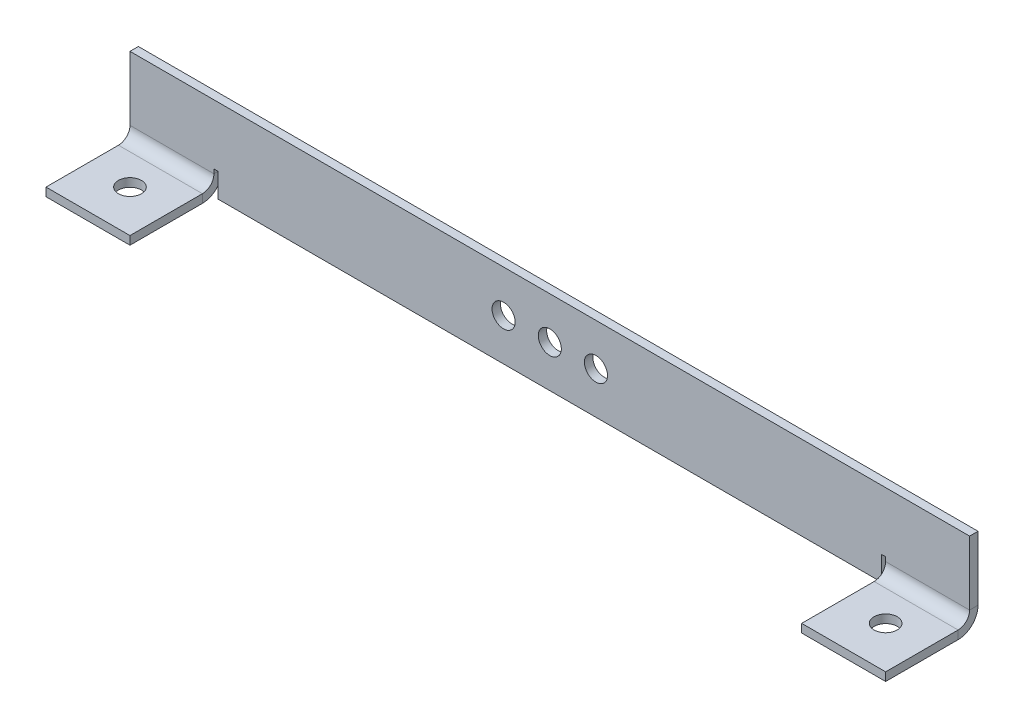
ISO-10303-21;
HEADER;
FILE_DESCRIPTION(('STEP AP214'),'2;1');
FILE_NAME('part.step','',(''),(''),'','','');
FILE_SCHEMA(('AUTOMOTIVE_DESIGN { 1 0 10303 214 1 1 1 1 }'));
ENDSEC;
DATA;
#1=APPLICATION_CONTEXT('core data for automotive mechanical design processes');
#2=APPLICATION_PROTOCOL_DEFINITION('international standard','automotive_design',2000,#1);
#3=PRODUCT_CONTEXT('',#1,'mechanical');
#4=PRODUCT('Part','Part','',(#3));
#5=PRODUCT_RELATED_PRODUCT_CATEGORY('part','',(#4));
#6=PRODUCT_DEFINITION_FORMATION('','',#4);
#7=PRODUCT_DEFINITION_CONTEXT('part definition',#1,'design');
#8=PRODUCT_DEFINITION('design','',#6,#7);
#9=PRODUCT_DEFINITION_SHAPE('','',#8);
#10=(LENGTH_UNIT() NAMED_UNIT(*) SI_UNIT(.MILLI.,.METRE.));
#11=(NAMED_UNIT(*) PLANE_ANGLE_UNIT() SI_UNIT($,.RADIAN.));
#12=(NAMED_UNIT(*) SI_UNIT($,.STERADIAN.) SOLID_ANGLE_UNIT());
#13=UNCERTAINTY_MEASURE_WITH_UNIT(LENGTH_MEASURE(1.E-05),#10,'distance_accuracy_value','');
#14=(GEOMETRIC_REPRESENTATION_CONTEXT(3) GLOBAL_UNCERTAINTY_ASSIGNED_CONTEXT((#13)) GLOBAL_UNIT_ASSIGNED_CONTEXT((#10,
#11,#12)) REPRESENTATION_CONTEXT('',''));
#15=CARTESIAN_POINT('',(0.,0.,0.));
#16=DIRECTION('',(0.,0.,1.));
#17=DIRECTION('',(1.,0.,0.));
#18=AXIS2_PLACEMENT_3D('',#15,#16,#17);
#19=CARTESIAN_POINT('',(100.,-20.,-2.));
#20=DIRECTION('',(0.,-1.,0.));
#21=DIRECTION('',(0.,0.,-1.));
#22=AXIS2_PLACEMENT_3D('',#19,#20,#21);
#23=PLANE('',#22);
#24=DIRECTION('',(1.,0.,0.));
#25=VECTOR('',#24,1.);
#26=CARTESIAN_POINT('',(100.,-20.,-2.));
#27=LINE('',#26,#25);
#28=CARTESIAN_POINT('',(-79.,-20.,-2.));
#29=VERTEX_POINT('',#28);
#30=CARTESIAN_POINT('',(79.,-20.,-2.));
#31=VERTEX_POINT('',#30);
#32=EDGE_CURVE('E347',#29,#31,#27,.T.);
#33=ORIENTED_EDGE('',*,*,#32,.T.);
#34=DIRECTION('',(0.,0.,-1.));
#35=VECTOR('',#34,1.);
#36=CARTESIAN_POINT('',(79.,-20.,0.));
#37=LINE('',#36,#35);
#38=CARTESIAN_POINT('',(79.,-20.,0.));
#39=VERTEX_POINT('',#38);
#40=EDGE_CURVE('E243',#39,#31,#37,.T.);
#41=ORIENTED_EDGE('',*,*,#40,.F.);
#42=DIRECTION('',(1.,0.,0.));
#43=VECTOR('',#42,1.);
#44=CARTESIAN_POINT('',(100.,-20.,0.));
#45=LINE('',#44,#43);
#46=CARTESIAN_POINT('',(-79.,-20.,0.));
#47=VERTEX_POINT('',#46);
#48=EDGE_CURVE('E129',#47,#39,#45,.T.);
#49=ORIENTED_EDGE('',*,*,#48,.F.);
#50=DIRECTION('',(0.,0.,-1.));
#51=VECTOR('',#50,1.);
#52=CARTESIAN_POINT('',(-79.,-20.,0.));
#53=LINE('',#52,#51);
#54=EDGE_CURVE('E328',#47,#29,#53,.T.);
#55=ORIENTED_EDGE('',*,*,#54,.T.);
#56=EDGE_LOOP('',(#33,#41,#49,#55));
#57=FACE_BOUND('',#56,.T.);
#58=ADVANCED_FACE('F78',(#57),#23,.T.);
#59=CARTESIAN_POINT('',(0.,0.,-2.));
#60=DIRECTION('',(0.,0.,1.));
#61=DIRECTION('',(1.,0.,0.));
#62=AXIS2_PLACEMENT_3D('',#59,#60,#61);
#63=PLANE('',#62);
#64=CARTESIAN_POINT('',(11.,-10.,-2.));
#65=DIRECTION('',(0.,0.,-1.));
#66=DIRECTION('',(-1.,0.,0.));
#67=AXIS2_PLACEMENT_3D('',#64,#65,#66);
#68=CIRCLE('',#67,2.75);
#69=CARTESIAN_POINT('',(8.25,-10.,-2.));
#70=VERTEX_POINT('',#69);
#71=EDGE_CURVE('E155',#70,#70,#68,.T.);
#72=ORIENTED_EDGE('',*,*,#71,.F.);
#73=EDGE_LOOP('',(#72));
#74=FACE_BOUND('',#73,.T.);
#75=CARTESIAN_POINT('',(-11.,-10.,-2.));
#76=DIRECTION('',(0.,0.,-1.));
#77=DIRECTION('',(1.,0.,0.));
#78=AXIS2_PLACEMENT_3D('',#75,#76,#77);
#79=CIRCLE('',#78,2.75);
#80=CARTESIAN_POINT('',(-8.25,-10.,-2.));
#81=VERTEX_POINT('',#80);
#82=EDGE_CURVE('E160',#81,#81,#79,.T.);
#83=ORIENTED_EDGE('',*,*,#82,.F.);
#84=EDGE_LOOP('',(#83));
#85=FACE_BOUND('',#84,.T.);
#86=CARTESIAN_POINT('',(0.,-10.,-2.));
#87=DIRECTION('',(0.,0.,-1.));
#88=DIRECTION('',(-1.,0.,0.));
#89=AXIS2_PLACEMENT_3D('',#86,#87,#88);
#90=CIRCLE('',#89,2.75);
#91=CARTESIAN_POINT('',(-2.75,-10.,-2.));
#92=VERTEX_POINT('',#91);
#93=EDGE_CURVE('E152',#92,#92,#90,.T.);
#94=ORIENTED_EDGE('',*,*,#93,.F.);
#95=EDGE_LOOP('',(#94));
#96=FACE_BOUND('',#95,.T.);
#97=DIRECTION('',(1.,0.,0.));
#98=VECTOR('',#97,1.);
#99=CARTESIAN_POINT('',(100.,-15.2634,-2.));
#100=LINE('',#99,#98);
#101=CARTESIAN_POINT('',(100.,-15.2634,-2.));
#102=VERTEX_POINT('',#101);
#103=CARTESIAN_POINT('',(80.,-15.2634,-2.));
#104=VERTEX_POINT('',#103);
#105=EDGE_CURVE('E211',#102,#104,#100,.F.);
#106=ORIENTED_EDGE('',*,*,#105,.T.);
#107=DIRECTION('',(0.,-1.,0.));
#108=VECTOR('',#107,1.);
#109=CARTESIAN_POINT('',(80.,0.,-2.));
#110=LINE('',#109,#108);
#111=CARTESIAN_POINT('',(80.,-14.2634,-2.));
#112=VERTEX_POINT('',#111);
#113=EDGE_CURVE('E255',#112,#104,#110,.T.);
#114=ORIENTED_EDGE('',*,*,#113,.F.);
#115=DIRECTION('',(1.,0.,0.));
#116=VECTOR('',#115,1.);
#117=CARTESIAN_POINT('',(0.,-14.2634,-2.));
#118=LINE('',#117,#116);
#119=CARTESIAN_POINT('',(79.,-14.2634,-2.));
#120=VERTEX_POINT('',#119);
#121=EDGE_CURVE('E252',#120,#112,#118,.T.);
#122=ORIENTED_EDGE('',*,*,#121,.F.);
#123=DIRECTION('',(0.,1.,0.));
#124=VECTOR('',#123,1.);
#125=CARTESIAN_POINT('',(79.,0.,-2.));
#126=LINE('',#125,#124);
#127=EDGE_CURVE('E235',#31,#120,#126,.T.);
#128=ORIENTED_EDGE('',*,*,#127,.F.);
#129=ORIENTED_EDGE('',*,*,#32,.F.);
#130=DIRECTION('',(0.,-1.,0.));
#131=VECTOR('',#130,1.);
#132=CARTESIAN_POINT('',(-79.,-1.91114115820755E-13,-2.));
#133=LINE('',#132,#131);
#134=CARTESIAN_POINT('',(-79.,-14.2634,-2.));
#135=VERTEX_POINT('',#134);
#136=EDGE_CURVE('E137',#135,#29,#133,.T.);
#137=ORIENTED_EDGE('',*,*,#136,.F.);
#138=DIRECTION('',(1.,0.,0.));
#139=VECTOR('',#138,1.);
#140=CARTESIAN_POINT('',(0.,-14.2634,-2.));
#141=LINE('',#140,#139);
#142=CARTESIAN_POINT('',(-80.,-14.2634,-2.));
#143=VERTEX_POINT('',#142);
#144=EDGE_CURVE('E141',#143,#135,#141,.T.);
#145=ORIENTED_EDGE('',*,*,#144,.F.);
#146=DIRECTION('',(0.,1.,0.));
#147=VECTOR('',#146,1.);
#148=CARTESIAN_POINT('',(-80.,0.,-2.));
#149=LINE('',#148,#147);
#150=CARTESIAN_POINT('',(-80.,-15.2634,-2.));
#151=VERTEX_POINT('',#150);
#152=EDGE_CURVE('E327',#151,#143,#149,.T.);
#153=ORIENTED_EDGE('',*,*,#152,.F.);
#154=DIRECTION('',(1.,0.,0.));
#155=VECTOR('',#154,1.);
#156=CARTESIAN_POINT('',(-80.,-15.2634,-2.));
#157=LINE('',#156,#155);
#158=CARTESIAN_POINT('',(-100.,-15.2634,-2.));
#159=VERTEX_POINT('',#158);
#160=EDGE_CURVE('E301',#151,#159,#157,.F.);
#161=ORIENTED_EDGE('',*,*,#160,.T.);
#162=DIRECTION('',(0.,-1.,0.));
#163=VECTOR('',#162,1.);
#164=CARTESIAN_POINT('',(-100.,-20.,-2.));
#165=LINE('',#164,#163);
#166=CARTESIAN_POINT('',(-100.,0.,-2.));
#167=VERTEX_POINT('',#166);
#168=EDGE_CURVE('E345',#167,#159,#165,.T.);
#169=ORIENTED_EDGE('',*,*,#168,.F.);
#170=DIRECTION('',(-1.,0.,0.));
#171=VECTOR('',#170,1.);
#172=CARTESIAN_POINT('',(-100.,0.,-2.));
#173=LINE('',#172,#171);
#174=CARTESIAN_POINT('',(100.,0.,-2.));
#175=VERTEX_POINT('',#174);
#176=EDGE_CURVE('E128',#175,#167,#173,.T.);
#177=ORIENTED_EDGE('',*,*,#176,.F.);
#178=DIRECTION('',(0.,1.,0.));
#179=VECTOR('',#178,1.);
#180=CARTESIAN_POINT('',(100.,-20.,-2.));
#181=LINE('',#180,#179);
#182=EDGE_CURVE('E103',#102,#175,#181,.T.);
#183=ORIENTED_EDGE('',*,*,#182,.F.);
#184=EDGE_LOOP('',(#106,#114,#122,#128,#129,#137,#145,#153,#161,#169,#177,#183));
#185=FACE_BOUND('',#184,.T.);
#186=ADVANCED_FACE('F362',(#74,#85,#96,#185),#63,.F.);
#187=CARTESIAN_POINT('',(0.,0.,0.));
#188=DIRECTION('',(0.,0.,1.));
#189=DIRECTION('',(1.,0.,0.));
#190=AXIS2_PLACEMENT_3D('',#187,#188,#189);
#191=PLANE('',#190);
#192=CARTESIAN_POINT('',(11.,-10.,0.));
#193=DIRECTION('',(0.,0.,1.));
#194=DIRECTION('',(1.,0.,0.));
#195=AXIS2_PLACEMENT_3D('',#192,#193,#194);
#196=CIRCLE('',#195,2.75);
#197=CARTESIAN_POINT('',(13.75,-10.,0.));
#198=VERTEX_POINT('',#197);
#199=EDGE_CURVE('E82',#198,#198,#196,.T.);
#200=ORIENTED_EDGE('',*,*,#199,.F.);
#201=EDGE_LOOP('',(#200));
#202=FACE_BOUND('',#201,.T.);
#203=CARTESIAN_POINT('',(-11.,-10.,0.));
#204=DIRECTION('',(0.,0.,1.));
#205=DIRECTION('',(1.,0.,0.));
#206=AXIS2_PLACEMENT_3D('',#203,#204,#205);
#207=CIRCLE('',#206,2.75);
#208=CARTESIAN_POINT('',(-8.25,-10.,0.));
#209=VERTEX_POINT('',#208);
#210=EDGE_CURVE('E153',#209,#209,#207,.T.);
#211=ORIENTED_EDGE('',*,*,#210,.F.);
#212=EDGE_LOOP('',(#211));
#213=FACE_BOUND('',#212,.T.);
#214=CARTESIAN_POINT('',(0.,-10.,0.));
#215=DIRECTION('',(0.,0.,1.));
#216=DIRECTION('',(1.,0.,0.));
#217=AXIS2_PLACEMENT_3D('',#214,#215,#216);
#218=CIRCLE('',#217,2.75);
#219=CARTESIAN_POINT('',(2.75,-10.,0.));
#220=VERTEX_POINT('',#219);
#221=EDGE_CURVE('E149',#220,#220,#218,.T.);
#222=ORIENTED_EDGE('',*,*,#221,.F.);
#223=EDGE_LOOP('',(#222));
#224=FACE_BOUND('',#223,.T.);
#225=DIRECTION('',(0.,1.,0.));
#226=VECTOR('',#225,1.);
#227=CARTESIAN_POINT('',(80.,-15.2634,0.));
#228=LINE('',#227,#226);
#229=CARTESIAN_POINT('',(80.,-15.2634,0.));
#230=VERTEX_POINT('',#229);
#231=CARTESIAN_POINT('',(80.,-14.2634,0.));
#232=VERTEX_POINT('',#231);
#233=EDGE_CURVE('E232',#230,#232,#228,.T.);
#234=ORIENTED_EDGE('',*,*,#233,.F.);
#235=DIRECTION('',(1.,0.,0.));
#236=VECTOR('',#235,1.);
#237=CARTESIAN_POINT('',(100.,-15.2634,0.));
#238=LINE('',#237,#236);
#239=CARTESIAN_POINT('',(100.,-15.2634,0.));
#240=VERTEX_POINT('',#239);
#241=EDGE_CURVE('E126',#240,#230,#238,.F.);
#242=ORIENTED_EDGE('',*,*,#241,.F.);
#243=DIRECTION('',(0.,1.,0.));
#244=VECTOR('',#243,1.);
#245=CARTESIAN_POINT('',(100.,-20.,0.));
#246=LINE('',#245,#244);
#247=CARTESIAN_POINT('',(100.,0.,0.));
#248=VERTEX_POINT('',#247);
#249=EDGE_CURVE('E118',#240,#248,#246,.T.);
#250=ORIENTED_EDGE('',*,*,#249,.T.);
#251=DIRECTION('',(-1.,0.,0.));
#252=VECTOR('',#251,1.);
#253=CARTESIAN_POINT('',(-100.,0.,0.));
#254=LINE('',#253,#252);
#255=CARTESIAN_POINT('',(-100.,0.,0.));
#256=VERTEX_POINT('',#255);
#257=EDGE_CURVE('E123',#248,#256,#254,.T.);
#258=ORIENTED_EDGE('',*,*,#257,.T.);
#259=DIRECTION('',(0.,-1.,0.));
#260=VECTOR('',#259,1.);
#261=CARTESIAN_POINT('',(-100.,-20.,0.));
#262=LINE('',#261,#260);
#263=CARTESIAN_POINT('',(-100.,-15.2634,0.));
#264=VERTEX_POINT('',#263);
#265=EDGE_CURVE('E136',#256,#264,#262,.T.);
#266=ORIENTED_EDGE('',*,*,#265,.T.);
#267=DIRECTION('',(1.,0.,0.));
#268=VECTOR('',#267,1.);
#269=CARTESIAN_POINT('',(-80.,-15.2634,0.));
#270=LINE('',#269,#268);
#271=CARTESIAN_POINT('',(-80.,-15.2634,0.));
#272=VERTEX_POINT('',#271);
#273=EDGE_CURVE('E314',#272,#264,#270,.F.);
#274=ORIENTED_EDGE('',*,*,#273,.F.);
#275=DIRECTION('',(0.,-1.,0.));
#276=VECTOR('',#275,1.);
#277=CARTESIAN_POINT('',(-80.,-14.2634,0.));
#278=LINE('',#277,#276);
#279=CARTESIAN_POINT('',(-80.,-14.2634,0.));
#280=VERTEX_POINT('',#279);
#281=EDGE_CURVE('E95',#280,#272,#278,.T.);
#282=ORIENTED_EDGE('',*,*,#281,.F.);
#283=DIRECTION('',(-1.,0.,0.));
#284=VECTOR('',#283,1.);
#285=CARTESIAN_POINT('',(-79.,-14.2634,0.));
#286=LINE('',#285,#284);
#287=CARTESIAN_POINT('',(-79.,-14.2634,0.));
#288=VERTEX_POINT('',#287);
#289=EDGE_CURVE('E329',#288,#280,#286,.T.);
#290=ORIENTED_EDGE('',*,*,#289,.F.);
#291=DIRECTION('',(0.,1.,0.));
#292=VECTOR('',#291,1.);
#293=CARTESIAN_POINT('',(-79.,-20.,0.));
#294=LINE('',#293,#292);
#295=EDGE_CURVE('E324',#47,#288,#294,.T.);
#296=ORIENTED_EDGE('',*,*,#295,.F.);
#297=ORIENTED_EDGE('',*,*,#48,.T.);
#298=DIRECTION('',(0.,-1.,0.));
#299=VECTOR('',#298,1.);
#300=CARTESIAN_POINT('',(79.,-14.2634,0.));
#301=LINE('',#300,#299);
#302=CARTESIAN_POINT('',(79.,-14.2634,0.));
#303=VERTEX_POINT('',#302);
#304=EDGE_CURVE('E240',#303,#39,#301,.T.);
#305=ORIENTED_EDGE('',*,*,#304,.F.);
#306=DIRECTION('',(-1.,0.,0.));
#307=VECTOR('',#306,1.);
#308=CARTESIAN_POINT('',(80.,-14.2634,0.));
#309=LINE('',#308,#307);
#310=EDGE_CURVE('E236',#232,#303,#309,.T.);
#311=ORIENTED_EDGE('',*,*,#310,.F.);
#312=EDGE_LOOP('',(#234,#242,#250,#258,#266,#274,#282,#290,#296,#297,#305,#311));
#313=FACE_BOUND('',#312,.T.);
#314=ADVANCED_FACE('F120',(#202,#213,#224,#313),#191,.T.);
#315=CARTESIAN_POINT('',(100.,-20.,-2.));
#316=DIRECTION('',(1.,0.,0.));
#317=DIRECTION('',(0.,1.,0.));
#318=AXIS2_PLACEMENT_3D('',#315,#316,#317);
#319=PLANE('',#318);
#320=ORIENTED_EDGE('',*,*,#249,.F.);
#321=DIRECTION('',(0.,0.,-1.));
#322=VECTOR('',#321,1.);
#323=CARTESIAN_POINT('',(100.,-15.2634,0.));
#324=LINE('',#323,#322);
#325=EDGE_CURVE('E218',#240,#102,#324,.T.);
#326=ORIENTED_EDGE('',*,*,#325,.T.);
#327=ORIENTED_EDGE('',*,*,#182,.T.);
#328=DIRECTION('',(0.,0.,1.));
#329=VECTOR('',#328,1.);
#330=CARTESIAN_POINT('',(100.,0.,-2.));
#331=LINE('',#330,#329);
#332=EDGE_CURVE('E13',#175,#248,#331,.T.);
#333=ORIENTED_EDGE('',*,*,#332,.T.);
#334=EDGE_LOOP('',(#320,#326,#327,#333));
#335=FACE_BOUND('',#334,.T.);
#336=ADVANCED_FACE('F131',(#335),#319,.T.);
#337=CARTESIAN_POINT('',(-100.,0.,-2.));
#338=DIRECTION('',(0.,1.,0.));
#339=DIRECTION('',(0.,0.,1.));
#340=AXIS2_PLACEMENT_3D('',#337,#338,#339);
#341=PLANE('',#340);
#342=ORIENTED_EDGE('',*,*,#257,.F.);
#343=ORIENTED_EDGE('',*,*,#332,.F.);
#344=ORIENTED_EDGE('',*,*,#176,.T.);
#345=DIRECTION('',(0.,0.,1.));
#346=VECTOR('',#345,1.);
#347=CARTESIAN_POINT('',(-100.,0.,-2.));
#348=LINE('',#347,#346);
#349=EDGE_CURVE('E87',#167,#256,#348,.T.);
#350=ORIENTED_EDGE('',*,*,#349,.T.);
#351=EDGE_LOOP('',(#342,#343,#344,#350));
#352=FACE_BOUND('',#351,.T.);
#353=ADVANCED_FACE('F80',(#352),#341,.T.);
#354=CARTESIAN_POINT('',(-100.,-20.,-2.));
#355=DIRECTION('',(-1.,0.,0.));
#356=DIRECTION('',(0.,-1.,0.));
#357=AXIS2_PLACEMENT_3D('',#354,#355,#356);
#358=PLANE('',#357);
#359=DIRECTION('',(0.,0.,-1.));
#360=VECTOR('',#359,1.);
#361=CARTESIAN_POINT('',(-100.,-15.2634,0.));
#362=LINE('',#361,#360);
#363=EDGE_CURVE('E319',#264,#159,#362,.T.);
#364=ORIENTED_EDGE('',*,*,#363,.F.);
#365=ORIENTED_EDGE('',*,*,#265,.F.);
#366=ORIENTED_EDGE('',*,*,#349,.F.);
#367=ORIENTED_EDGE('',*,*,#168,.T.);
#368=EDGE_LOOP('',(#364,#365,#366,#367));
#369=FACE_BOUND('',#368,.T.);
#370=ADVANCED_FACE('F495',(#369),#358,.T.);
#371=CARTESIAN_POINT('',(-79.,-20.,0.));
#372=DIRECTION('',(-1.,0.,0.));
#373=DIRECTION('',(0.,-1.,0.));
#374=AXIS2_PLACEMENT_3D('',#371,#372,#373);
#375=PLANE('',#374);
#376=DIRECTION('',(0.,0.,-1.));
#377=VECTOR('',#376,1.);
#378=CARTESIAN_POINT('',(-79.,-14.2634,0.));
#379=LINE('',#378,#377);
#380=EDGE_CURVE('E332',#288,#135,#379,.T.);
#381=ORIENTED_EDGE('',*,*,#380,.T.);
#382=ORIENTED_EDGE('',*,*,#136,.T.);
#383=ORIENTED_EDGE('',*,*,#54,.F.);
#384=ORIENTED_EDGE('',*,*,#295,.T.);
#385=EDGE_LOOP('',(#381,#382,#383,#384));
#386=FACE_BOUND('',#385,.T.);
#387=ADVANCED_FACE('F497',(#386),#375,.T.);
#388=CARTESIAN_POINT('',(-79.,-14.2634,0.));
#389=DIRECTION('',(0.,-1.,0.));
#390=DIRECTION('',(0.,0.,-1.));
#391=AXIS2_PLACEMENT_3D('',#388,#389,#390);
#392=PLANE('',#391);
#393=DIRECTION('',(0.,0.,-1.));
#394=VECTOR('',#393,1.);
#395=CARTESIAN_POINT('',(-80.,-14.2634,0.));
#396=LINE('',#395,#394);
#397=EDGE_CURVE('E322',#280,#143,#396,.T.);
#398=ORIENTED_EDGE('',*,*,#397,.T.);
#399=ORIENTED_EDGE('',*,*,#144,.T.);
#400=ORIENTED_EDGE('',*,*,#380,.F.);
#401=ORIENTED_EDGE('',*,*,#289,.T.);
#402=EDGE_LOOP('',(#398,#399,#400,#401));
#403=FACE_BOUND('',#402,.T.);
#404=ADVANCED_FACE('F503',(#403),#392,.T.);
#405=CARTESIAN_POINT('',(-80.,-14.2634,0.));
#406=DIRECTION('',(1.,0.,0.));
#407=DIRECTION('',(0.,0.,-1.));
#408=AXIS2_PLACEMENT_3D('',#405,#406,#407);
#409=PLANE('',#408);
#410=DIRECTION('',(0.,0.,-1.));
#411=VECTOR('',#410,1.);
#412=CARTESIAN_POINT('',(-80.,-15.2634,0.));
#413=LINE('',#412,#411);
#414=EDGE_CURVE('E308',#272,#151,#413,.T.);
#415=ORIENTED_EDGE('',*,*,#414,.T.);
#416=ORIENTED_EDGE('',*,*,#152,.T.);
#417=ORIENTED_EDGE('',*,*,#397,.F.);
#418=ORIENTED_EDGE('',*,*,#281,.T.);
#419=EDGE_LOOP('',(#415,#416,#417,#418));
#420=FACE_BOUND('',#419,.T.);
#421=ADVANCED_FACE('F536',(#420),#409,.T.);
#422=CARTESIAN_POINT('',(-100.,-15.2634,2.7366));
#423=DIRECTION('',(-1.,0.,0.));
#424=DIRECTION('',(0.,0.,1.));
#425=AXIS2_PLACEMENT_3D('',#422,#423,#424);
#426=PLANE('',#425);
#427=DIRECTION('',(0.,-1.,0.));
#428=VECTOR('',#427,1.);
#429=CARTESIAN_POINT('',(-100.,-20.,2.73659999999999));
#430=LINE('',#429,#428);
#431=CARTESIAN_POINT('',(-100.,-18.,2.73659999999999));
#432=VERTEX_POINT('',#431);
#433=CARTESIAN_POINT('',(-100.,-20.,2.73659999999998));
#434=VERTEX_POINT('',#433);
#435=EDGE_CURVE('E264',#432,#434,#430,.T.);
#436=ORIENTED_EDGE('',*,*,#435,.F.);
#437=CARTESIAN_POINT('',(-100.,-15.2634,2.7366));
#438=DIRECTION('',(1.,0.,0.));
#439=DIRECTION('',(0.,0.,-1.));
#440=AXIS2_PLACEMENT_3D('',#437,#438,#439);
#441=CIRCLE('',#440,2.7366);
#442=EDGE_CURVE('E311',#264,#432,#441,.F.);
#443=ORIENTED_EDGE('',*,*,#442,.F.);
#444=ORIENTED_EDGE('',*,*,#363,.T.);
#445=CARTESIAN_POINT('',(-100.,-15.2634,2.7366));
#446=DIRECTION('',(1.,0.,0.));
#447=DIRECTION('',(0.,0.,-1.));
#448=AXIS2_PLACEMENT_3D('',#445,#446,#447);
#449=CIRCLE('',#448,4.7366);
#450=EDGE_CURVE('E304',#159,#434,#449,.F.);
#451=ORIENTED_EDGE('',*,*,#450,.T.);
#452=EDGE_LOOP('',(#436,#443,#444,#451));
#453=FACE_BOUND('',#452,.T.);
#454=ADVANCED_FACE('F514',(#453),#426,.T.);
#455=CARTESIAN_POINT('',(-80.,-15.2634,2.7366));
#456=DIRECTION('',(-1.,0.,0.));
#457=DIRECTION('',(0.,0.,1.));
#458=AXIS2_PLACEMENT_3D('',#455,#456,#457);
#459=PLANE('',#458);
#460=CARTESIAN_POINT('',(-80.,-15.2634,2.7366));
#461=DIRECTION('',(1.,0.,0.));
#462=DIRECTION('',(0.,0.,-1.));
#463=AXIS2_PLACEMENT_3D('',#460,#461,#462);
#464=CIRCLE('',#463,2.7366);
#465=CARTESIAN_POINT('',(-80.,-18.,2.73659999999999));
#466=VERTEX_POINT('',#465);
#467=EDGE_CURVE('E268',#466,#272,#464,.T.);
#468=ORIENTED_EDGE('',*,*,#467,.F.);
#469=DIRECTION('',(0.,-1.,0.));
#470=VECTOR('',#469,1.);
#471=CARTESIAN_POINT('',(-80.,-18.,2.73659999999999));
#472=LINE('',#471,#470);
#473=CARTESIAN_POINT('',(-80.,-20.,2.73659999999998));
#474=VERTEX_POINT('',#473);
#475=EDGE_CURVE('E293',#466,#474,#472,.T.);
#476=ORIENTED_EDGE('',*,*,#475,.T.);
#477=CARTESIAN_POINT('',(-80.,-15.2634,2.7366));
#478=DIRECTION('',(1.,0.,0.));
#479=DIRECTION('',(0.,0.,-1.));
#480=AXIS2_PLACEMENT_3D('',#477,#478,#479);
#481=CIRCLE('',#480,4.7366);
#482=EDGE_CURVE('E305',#474,#151,#481,.T.);
#483=ORIENTED_EDGE('',*,*,#482,.T.);
#484=ORIENTED_EDGE('',*,*,#414,.F.);
#485=EDGE_LOOP('',(#468,#476,#483,#484));
#486=FACE_BOUND('',#485,.T.);
#487=ADVANCED_FACE('F534',(#486),#459,.F.);
#488=CARTESIAN_POINT('',(-80.,-15.2634,2.7366));
#489=DIRECTION('',(1.,0.,0.));
#490=DIRECTION('',(0.,-1.,0.));
#491=AXIS2_PLACEMENT_3D('',#488,#489,#490);
#492=CYLINDRICAL_SURFACE('',#491,4.7366);
#493=ORIENTED_EDGE('',*,*,#160,.F.);
#494=ORIENTED_EDGE('',*,*,#482,.F.);
#495=DIRECTION('',(1.,0.,0.));
#496=VECTOR('',#495,1.);
#497=CARTESIAN_POINT('',(0.,-20.,2.73659999999997));
#498=LINE('',#497,#496);
#499=EDGE_CURVE('E290',#434,#474,#498,.T.);
#500=ORIENTED_EDGE('',*,*,#499,.F.);
#501=ORIENTED_EDGE('',*,*,#450,.F.);
#502=EDGE_LOOP('',(#493,#494,#500,#501));
#503=FACE_BOUND('',#502,.T.);
#504=ADVANCED_FACE('F538',(#503),#492,.T.);
#505=CARTESIAN_POINT('',(-80.,-15.2634,2.7366));
#506=DIRECTION('',(1.,0.,0.));
#507=DIRECTION('',(0.,-1.,0.));
#508=AXIS2_PLACEMENT_3D('',#505,#506,#507);
#509=CYLINDRICAL_SURFACE('',#508,2.7366);
#510=ORIENTED_EDGE('',*,*,#273,.T.);
#511=ORIENTED_EDGE('',*,*,#442,.T.);
#512=DIRECTION('',(-1.,0.,0.));
#513=VECTOR('',#512,1.);
#514=CARTESIAN_POINT('',(-100.,-18.,2.73659999999999));
#515=LINE('',#514,#513);
#516=EDGE_CURVE('E296',#432,#466,#515,.F.);
#517=ORIENTED_EDGE('',*,*,#516,.T.);
#518=ORIENTED_EDGE('',*,*,#467,.T.);
#519=EDGE_LOOP('',(#510,#511,#517,#518));
#520=FACE_BOUND('',#519,.T.);
#521=ADVANCED_FACE('F511',(#520),#509,.F.);
#522=CARTESIAN_POINT('',(-80.,-20.,0.));
#523=DIRECTION('',(1.,0.,0.));
#524=DIRECTION('',(0.,0.,-1.));
#525=AXIS2_PLACEMENT_3D('',#522,#523,#524);
#526=PLANE('',#525);
#527=DIRECTION('',(0.,0.,-1.));
#528=VECTOR('',#527,1.);
#529=CARTESIAN_POINT('',(-80.,-20.,0.));
#530=LINE('',#529,#528);
#531=CARTESIAN_POINT('',(-80.,-20.0000000000001,20.));
#532=VERTEX_POINT('',#531);
#533=EDGE_CURVE('E272',#532,#474,#530,.T.);
#534=ORIENTED_EDGE('',*,*,#533,.T.);
#535=ORIENTED_EDGE('',*,*,#475,.F.);
#536=DIRECTION('',(0.,0.,1.));
#537=VECTOR('',#536,1.);
#538=CARTESIAN_POINT('',(-80.,-18.,0.));
#539=LINE('',#538,#537);
#540=CARTESIAN_POINT('',(-80.,-18.0000000000001,20.));
#541=VERTEX_POINT('',#540);
#542=EDGE_CURVE('E281',#541,#466,#539,.F.);
#543=ORIENTED_EDGE('',*,*,#542,.F.);
#544=DIRECTION('',(0.,1.,0.));
#545=VECTOR('',#544,1.);
#546=CARTESIAN_POINT('',(-80.,-20.0000000000001,20.));
#547=LINE('',#546,#545);
#548=EDGE_CURVE('E265',#532,#541,#547,.T.);
#549=ORIENTED_EDGE('',*,*,#548,.F.);
#550=EDGE_LOOP('',(#534,#535,#543,#549));
#551=FACE_BOUND('',#550,.T.);
#552=ADVANCED_FACE('F532',(#551),#526,.T.);
#553=CARTESIAN_POINT('',(-100.,-20.0000000000001,20.));
#554=DIRECTION('',(-1.,0.,0.));
#555=DIRECTION('',(0.,0.,1.));
#556=AXIS2_PLACEMENT_3D('',#553,#554,#555);
#557=PLANE('',#556);
#558=DIRECTION('',(0.,0.,-1.));
#559=VECTOR('',#558,1.);
#560=CARTESIAN_POINT('',(-100.,-18.,0.));
#561=LINE('',#560,#559);
#562=CARTESIAN_POINT('',(-100.,-18.0000000000001,20.));
#563=VERTEX_POINT('',#562);
#564=EDGE_CURVE('E287',#432,#563,#561,.F.);
#565=ORIENTED_EDGE('',*,*,#564,.F.);
#566=ORIENTED_EDGE('',*,*,#435,.T.);
#567=DIRECTION('',(0.,0.,1.));
#568=VECTOR('',#567,1.);
#569=CARTESIAN_POINT('',(-100.,-20.0000000000001,20.));
#570=LINE('',#569,#568);
#571=CARTESIAN_POINT('',(-100.,-20.0000000000001,20.));
#572=VERTEX_POINT('',#571);
#573=EDGE_CURVE('E278',#434,#572,#570,.T.);
#574=ORIENTED_EDGE('',*,*,#573,.T.);
#575=DIRECTION('',(0.,1.,0.));
#576=VECTOR('',#575,1.);
#577=CARTESIAN_POINT('',(-100.,-20.0000000000001,20.));
#578=LINE('',#577,#576);
#579=EDGE_CURVE('E269',#572,#563,#578,.T.);
#580=ORIENTED_EDGE('',*,*,#579,.T.);
#581=EDGE_LOOP('',(#565,#566,#574,#580));
#582=FACE_BOUND('',#581,.T.);
#583=ADVANCED_FACE('F518',(#582),#557,.T.);
#584=CARTESIAN_POINT('',(0.,-20.,0.));
#585=DIRECTION('',(0.,-1.,0.));
#586=DIRECTION('',(0.,0.,-1.));
#587=AXIS2_PLACEMENT_3D('',#584,#585,#586);
#588=PLANE('',#587);
#589=CARTESIAN_POINT('',(-90.,-20.,9.99999999999999));
#590=DIRECTION('',(0.,-1.,0.));
#591=DIRECTION('',(0.,0.,-1.));
#592=AXIS2_PLACEMENT_3D('',#589,#590,#591);
#593=CIRCLE('',#592,2.75000000000001);
#594=CARTESIAN_POINT('',(-90.,-20.,7.24999999999998));
#595=VERTEX_POINT('',#594);
#596=EDGE_CURVE('E261',#595,#595,#593,.T.);
#597=ORIENTED_EDGE('',*,*,#596,.F.);
#598=EDGE_LOOP('',(#597));
#599=FACE_BOUND('',#598,.T.);
#600=ORIENTED_EDGE('',*,*,#573,.F.);
#601=ORIENTED_EDGE('',*,*,#499,.T.);
#602=ORIENTED_EDGE('',*,*,#533,.F.);
#603=DIRECTION('',(1.,0.,0.));
#604=VECTOR('',#603,1.);
#605=CARTESIAN_POINT('',(-80.,-20.0000000000001,20.));
#606=LINE('',#605,#604);
#607=EDGE_CURVE('E275',#572,#532,#606,.T.);
#608=ORIENTED_EDGE('',*,*,#607,.F.);
#609=EDGE_LOOP('',(#600,#601,#602,#608));
#610=FACE_BOUND('',#609,.T.);
#611=ADVANCED_FACE('F522',(#599,#610),#588,.T.);
#612=CARTESIAN_POINT('',(0.,-18.,0.));
#613=DIRECTION('',(0.,-1.,0.));
#614=DIRECTION('',(0.,0.,-1.));
#615=AXIS2_PLACEMENT_3D('',#612,#613,#614);
#616=PLANE('',#615);
#617=CARTESIAN_POINT('',(-90.,-18.,10.));
#618=DIRECTION('',(0.,1.,0.));
#619=DIRECTION('',(0.,0.,1.));
#620=AXIS2_PLACEMENT_3D('',#617,#618,#619);
#621=CIRCLE('',#620,2.75000000000001);
#622=CARTESIAN_POINT('',(-90.,-18.,12.75));
#623=VERTEX_POINT('',#622);
#624=EDGE_CURVE('E258',#623,#623,#621,.T.);
#625=ORIENTED_EDGE('',*,*,#624,.F.);
#626=EDGE_LOOP('',(#625));
#627=FACE_BOUND('',#626,.T.);
#628=ORIENTED_EDGE('',*,*,#516,.F.);
#629=ORIENTED_EDGE('',*,*,#564,.T.);
#630=DIRECTION('',(-1.,0.,0.));
#631=VECTOR('',#630,1.);
#632=CARTESIAN_POINT('',(0.,-18.0000000000001,20.));
#633=LINE('',#632,#631);
#634=EDGE_CURVE('E284',#563,#541,#633,.F.);
#635=ORIENTED_EDGE('',*,*,#634,.T.);
#636=ORIENTED_EDGE('',*,*,#542,.T.);
#637=EDGE_LOOP('',(#628,#629,#635,#636));
#638=FACE_BOUND('',#637,.T.);
#639=ADVANCED_FACE('F529',(#627,#638),#616,.F.);
#640=CARTESIAN_POINT('',(-80.,-20.0000000000001,20.));
#641=DIRECTION('',(0.,0.,1.));
#642=DIRECTION('',(0.,-1.,0.));
#643=AXIS2_PLACEMENT_3D('',#640,#641,#642);
#644=PLANE('',#643);
#645=ORIENTED_EDGE('',*,*,#634,.F.);
#646=ORIENTED_EDGE('',*,*,#579,.F.);
#647=ORIENTED_EDGE('',*,*,#607,.T.);
#648=ORIENTED_EDGE('',*,*,#548,.T.);
#649=EDGE_LOOP('',(#645,#646,#647,#648));
#650=FACE_BOUND('',#649,.T.);
#651=ADVANCED_FACE('F526',(#650),#644,.T.);
#652=CARTESIAN_POINT('',(-90.,-28.,9.99999999999996));
#653=DIRECTION('',(0.,1.,0.));
#654=DIRECTION('',(0.,0.,1.));
#655=AXIS2_PLACEMENT_3D('',#652,#653,#654);
#656=CYLINDRICAL_SURFACE('',#655,2.75000000000001);
#657=ORIENTED_EDGE('',*,*,#596,.T.);
#658=EDGE_LOOP('',(#657));
#659=FACE_BOUND('',#658,.T.);
#660=ORIENTED_EDGE('',*,*,#624,.T.);
#661=EDGE_LOOP('',(#660));
#662=FACE_BOUND('',#661,.T.);
#663=ADVANCED_FACE('F552',(#659,#662),#656,.F.);
#664=CARTESIAN_POINT('',(80.,-15.2634,0.));
#665=DIRECTION('',(-1.,0.,0.));
#666=DIRECTION('',(0.,0.,1.));
#667=AXIS2_PLACEMENT_3D('',#664,#665,#666);
#668=PLANE('',#667);
#669=DIRECTION('',(0.,0.,-1.));
#670=VECTOR('',#669,1.);
#671=CARTESIAN_POINT('',(80.,-14.2634,0.));
#672=LINE('',#671,#670);
#673=EDGE_CURVE('E239',#232,#112,#672,.T.);
#674=ORIENTED_EDGE('',*,*,#673,.T.);
#675=ORIENTED_EDGE('',*,*,#113,.T.);
#676=DIRECTION('',(0.,0.,-1.));
#677=VECTOR('',#676,1.);
#678=CARTESIAN_POINT('',(80.,-15.2634,0.));
#679=LINE('',#678,#677);
#680=EDGE_CURVE('E227',#230,#104,#679,.T.);
#681=ORIENTED_EDGE('',*,*,#680,.F.);
#682=ORIENTED_EDGE('',*,*,#233,.T.);
#683=EDGE_LOOP('',(#674,#675,#681,#682));
#684=FACE_BOUND('',#683,.T.);
#685=ADVANCED_FACE('F550',(#684),#668,.T.);
#686=CARTESIAN_POINT('',(80.,-14.2634,0.));
#687=DIRECTION('',(0.,-1.,0.));
#688=DIRECTION('',(0.,0.,-1.));
#689=AXIS2_PLACEMENT_3D('',#686,#687,#688);
#690=PLANE('',#689);
#691=DIRECTION('',(0.,0.,-1.));
#692=VECTOR('',#691,1.);
#693=CARTESIAN_POINT('',(79.,-14.2634,0.));
#694=LINE('',#693,#692);
#695=EDGE_CURVE('E230',#303,#120,#694,.T.);
#696=ORIENTED_EDGE('',*,*,#695,.T.);
#697=ORIENTED_EDGE('',*,*,#121,.T.);
#698=ORIENTED_EDGE('',*,*,#673,.F.);
#699=ORIENTED_EDGE('',*,*,#310,.T.);
#700=EDGE_LOOP('',(#696,#697,#698,#699));
#701=FACE_BOUND('',#700,.T.);
#702=ADVANCED_FACE('F547',(#701),#690,.T.);
#703=CARTESIAN_POINT('',(79.,-14.2634,0.));
#704=DIRECTION('',(1.,0.,0.));
#705=DIRECTION('',(0.,0.,-1.));
#706=AXIS2_PLACEMENT_3D('',#703,#704,#705);
#707=PLANE('',#706);
#708=ORIENTED_EDGE('',*,*,#40,.T.);
#709=ORIENTED_EDGE('',*,*,#127,.T.);
#710=ORIENTED_EDGE('',*,*,#695,.F.);
#711=ORIENTED_EDGE('',*,*,#304,.T.);
#712=EDGE_LOOP('',(#708,#709,#710,#711));
#713=FACE_BOUND('',#712,.T.);
#714=ADVANCED_FACE('F545',(#713),#707,.T.);
#715=CARTESIAN_POINT('',(80.,-15.2634,2.7366));
#716=DIRECTION('',(-1.,0.,0.));
#717=DIRECTION('',(0.,0.,1.));
#718=AXIS2_PLACEMENT_3D('',#715,#716,#717);
#719=PLANE('',#718);
#720=DIRECTION('',(0.,1.,0.));
#721=VECTOR('',#720,1.);
#722=CARTESIAN_POINT('',(80.,-20.,2.73659999999998));
#723=LINE('',#722,#721);
#724=CARTESIAN_POINT('',(80.,-18.,2.73659999999999));
#725=VERTEX_POINT('',#724);
#726=CARTESIAN_POINT('',(80.,-20.,2.73659999999998));
#727=VERTEX_POINT('',#726);
#728=EDGE_CURVE('E174',#725,#727,#723,.F.);
#729=ORIENTED_EDGE('',*,*,#728,.F.);
#730=CARTESIAN_POINT('',(80.,-15.2634,2.7366));
#731=DIRECTION('',(1.,0.,0.));
#732=DIRECTION('',(0.,0.,-1.));
#733=AXIS2_PLACEMENT_3D('',#730,#731,#732);
#734=CIRCLE('',#733,2.7366);
#735=EDGE_CURVE('E221',#230,#725,#734,.F.);
#736=ORIENTED_EDGE('',*,*,#735,.F.);
#737=ORIENTED_EDGE('',*,*,#680,.T.);
#738=CARTESIAN_POINT('',(80.,-15.2634,2.7366));
#739=DIRECTION('',(1.,0.,0.));
#740=DIRECTION('',(0.,0.,-1.));
#741=AXIS2_PLACEMENT_3D('',#738,#739,#740);
#742=CIRCLE('',#741,4.7366);
#743=EDGE_CURVE('E214',#104,#727,#742,.F.);
#744=ORIENTED_EDGE('',*,*,#743,.T.);
#745=EDGE_LOOP('',(#729,#736,#737,#744));
#746=FACE_BOUND('',#745,.T.);
#747=ADVANCED_FACE('F467',(#746),#719,.T.);
#748=CARTESIAN_POINT('',(100.,-15.2634,2.7366));
#749=DIRECTION('',(-1.,0.,0.));
#750=DIRECTION('',(0.,0.,1.));
#751=AXIS2_PLACEMENT_3D('',#748,#749,#750);
#752=PLANE('',#751);
#753=CARTESIAN_POINT('',(100.,-15.2634,2.7366));
#754=DIRECTION('',(1.,0.,0.));
#755=DIRECTION('',(0.,0.,-1.));
#756=AXIS2_PLACEMENT_3D('',#753,#754,#755);
#757=CIRCLE('',#756,2.7366);
#758=CARTESIAN_POINT('',(100.,-18.,2.73659999999999));
#759=VERTEX_POINT('',#758);
#760=EDGE_CURVE('E178',#759,#240,#757,.T.);
#761=ORIENTED_EDGE('',*,*,#760,.F.);
#762=DIRECTION('',(0.,1.,0.));
#763=VECTOR('',#762,1.);
#764=CARTESIAN_POINT('',(100.,-18.,2.73659999999999));
#765=LINE('',#764,#763);
#766=CARTESIAN_POINT('',(100.,-20.,2.73659999999999));
#767=VERTEX_POINT('',#766);
#768=EDGE_CURVE('E203',#759,#767,#765,.F.);
#769=ORIENTED_EDGE('',*,*,#768,.T.);
#770=CARTESIAN_POINT('',(100.,-15.2634,2.7366));
#771=DIRECTION('',(1.,0.,0.));
#772=DIRECTION('',(0.,0.,-1.));
#773=AXIS2_PLACEMENT_3D('',#770,#771,#772);
#774=CIRCLE('',#773,4.7366);
#775=EDGE_CURVE('E215',#767,#102,#774,.T.);
#776=ORIENTED_EDGE('',*,*,#775,.T.);
#777=ORIENTED_EDGE('',*,*,#325,.F.);
#778=EDGE_LOOP('',(#761,#769,#776,#777));
#779=FACE_BOUND('',#778,.T.);
#780=ADVANCED_FACE('F448',(#779),#752,.F.);
#781=CARTESIAN_POINT('',(100.,-15.2634,2.7366));
#782=DIRECTION('',(1.,0.,0.));
#783=DIRECTION('',(0.,-1.,0.));
#784=AXIS2_PLACEMENT_3D('',#781,#782,#783);
#785=CYLINDRICAL_SURFACE('',#784,4.7366);
#786=ORIENTED_EDGE('',*,*,#105,.F.);
#787=ORIENTED_EDGE('',*,*,#775,.F.);
#788=DIRECTION('',(1.,0.,0.));
#789=VECTOR('',#788,1.);
#790=CARTESIAN_POINT('',(0.,-20.,2.73659999999997));
#791=LINE('',#790,#789);
#792=EDGE_CURVE('E200',#727,#767,#791,.T.);
#793=ORIENTED_EDGE('',*,*,#792,.F.);
#794=ORIENTED_EDGE('',*,*,#743,.F.);
#795=EDGE_LOOP('',(#786,#787,#793,#794));
#796=FACE_BOUND('',#795,.T.);
#797=ADVANCED_FACE('F443',(#796),#785,.T.);
#798=CARTESIAN_POINT('',(100.,-15.2634,2.7366));
#799=DIRECTION('',(1.,0.,0.));
#800=DIRECTION('',(0.,-1.,0.));
#801=AXIS2_PLACEMENT_3D('',#798,#799,#800);
#802=CYLINDRICAL_SURFACE('',#801,2.7366);
#803=ORIENTED_EDGE('',*,*,#241,.T.);
#804=ORIENTED_EDGE('',*,*,#735,.T.);
#805=DIRECTION('',(-1.,0.,0.));
#806=VECTOR('',#805,1.);
#807=CARTESIAN_POINT('',(80.,-18.,2.73659999999999));
#808=LINE('',#807,#806);
#809=EDGE_CURVE('E206',#725,#759,#808,.F.);
#810=ORIENTED_EDGE('',*,*,#809,.T.);
#811=ORIENTED_EDGE('',*,*,#760,.T.);
#812=EDGE_LOOP('',(#803,#804,#810,#811));
#813=FACE_BOUND('',#812,.T.);
#814=ADVANCED_FACE('F470',(#813),#802,.F.);
#815=CARTESIAN_POINT('',(100.,-20.0000000000001,20.));
#816=DIRECTION('',(-1.,0.,0.));
#817=DIRECTION('',(0.,0.,1.));
#818=AXIS2_PLACEMENT_3D('',#815,#816,#817);
#819=PLANE('',#818);
#820=ORIENTED_EDGE('',*,*,#768,.F.);
#821=DIRECTION('',(0.,0.,1.));
#822=VECTOR('',#821,1.);
#823=CARTESIAN_POINT('',(100.,-18.0000000000001,20.));
#824=LINE('',#823,#822);
#825=CARTESIAN_POINT('',(100.,-18.0000000000001,20.));
#826=VERTEX_POINT('',#825);
#827=EDGE_CURVE('E191',#759,#826,#824,.T.);
#828=ORIENTED_EDGE('',*,*,#827,.T.);
#829=DIRECTION('',(0.,1.,0.));
#830=VECTOR('',#829,1.);
#831=CARTESIAN_POINT('',(100.,-20.0000000000001,20.));
#832=LINE('',#831,#830);
#833=CARTESIAN_POINT('',(100.,-20.0000000000001,20.));
#834=VERTEX_POINT('',#833);
#835=EDGE_CURVE('E175',#834,#826,#832,.T.);
#836=ORIENTED_EDGE('',*,*,#835,.F.);
#837=DIRECTION('',(0.,0.,-1.));
#838=VECTOR('',#837,1.);
#839=CARTESIAN_POINT('',(100.,-20.,0.));
#840=LINE('',#839,#838);
#841=EDGE_CURVE('E182',#767,#834,#840,.F.);
#842=ORIENTED_EDGE('',*,*,#841,.F.);
#843=EDGE_LOOP('',(#820,#828,#836,#842));
#844=FACE_BOUND('',#843,.T.);
#845=ADVANCED_FACE('F456',(#844),#819,.F.);
#846=CARTESIAN_POINT('',(80.,-20.,0.));
#847=DIRECTION('',(1.,0.,0.));
#848=DIRECTION('',(0.,0.,-1.));
#849=AXIS2_PLACEMENT_3D('',#846,#847,#848);
#850=PLANE('',#849);
#851=ORIENTED_EDGE('',*,*,#728,.T.);
#852=DIRECTION('',(0.,0.,1.));
#853=VECTOR('',#852,1.);
#854=CARTESIAN_POINT('',(80.,-20.,0.));
#855=LINE('',#854,#853);
#856=CARTESIAN_POINT('',(80.,-20.0000000000001,20.));
#857=VERTEX_POINT('',#856);
#858=EDGE_CURVE('E188',#857,#727,#855,.F.);
#859=ORIENTED_EDGE('',*,*,#858,.F.);
#860=DIRECTION('',(0.,1.,0.));
#861=VECTOR('',#860,1.);
#862=CARTESIAN_POINT('',(80.,-20.0000000000001,20.));
#863=LINE('',#862,#861);
#864=CARTESIAN_POINT('',(80.,-18.0000000000001,20.));
#865=VERTEX_POINT('',#864);
#866=EDGE_CURVE('E179',#857,#865,#863,.T.);
#867=ORIENTED_EDGE('',*,*,#866,.T.);
#868=DIRECTION('',(0.,0.,-1.));
#869=VECTOR('',#868,1.);
#870=CARTESIAN_POINT('',(80.,-18.,0.));
#871=LINE('',#870,#869);
#872=EDGE_CURVE('E197',#865,#725,#871,.T.);
#873=ORIENTED_EDGE('',*,*,#872,.T.);
#874=EDGE_LOOP('',(#851,#859,#867,#873));
#875=FACE_BOUND('',#874,.T.);
#876=ADVANCED_FACE('F464',(#875),#850,.F.);
#877=CARTESIAN_POINT('',(0.,-20.,0.));
#878=DIRECTION('',(0.,-1.,0.));
#879=DIRECTION('',(0.,0.,-1.));
#880=AXIS2_PLACEMENT_3D('',#877,#878,#879);
#881=PLANE('',#880);
#882=CARTESIAN_POINT('',(90.,-20.,9.99999999999999));
#883=DIRECTION('',(0.,-1.,0.));
#884=DIRECTION('',(0.,0.,-1.));
#885=AXIS2_PLACEMENT_3D('',#882,#883,#884);
#886=CIRCLE('',#885,2.75000000000001);
#887=CARTESIAN_POINT('',(90.,-20.,7.24999999999998));
#888=VERTEX_POINT('',#887);
#889=EDGE_CURVE('E171',#888,#888,#886,.F.);
#890=ORIENTED_EDGE('',*,*,#889,.T.);
#891=EDGE_LOOP('',(#890));
#892=FACE_BOUND('',#891,.T.);
#893=ORIENTED_EDGE('',*,*,#858,.T.);
#894=ORIENTED_EDGE('',*,*,#792,.T.);
#895=ORIENTED_EDGE('',*,*,#841,.T.);
#896=DIRECTION('',(1.,0.,0.));
#897=VECTOR('',#896,1.);
#898=CARTESIAN_POINT('',(0.,-20.0000000000001,20.));
#899=LINE('',#898,#897);
#900=EDGE_CURVE('E185',#834,#857,#899,.F.);
#901=ORIENTED_EDGE('',*,*,#900,.T.);
#902=EDGE_LOOP('',(#893,#894,#895,#901));
#903=FACE_BOUND('',#902,.T.);
#904=ADVANCED_FACE('F453',(#892,#903),#881,.T.);
#905=CARTESIAN_POINT('',(0.,-18.,0.));
#906=DIRECTION('',(0.,-1.,0.));
#907=DIRECTION('',(0.,0.,-1.));
#908=AXIS2_PLACEMENT_3D('',#905,#906,#907);
#909=PLANE('',#908);
#910=CARTESIAN_POINT('',(90.,-18.,10.));
#911=DIRECTION('',(0.,-1.,0.));
#912=DIRECTION('',(0.,0.,1.));
#913=AXIS2_PLACEMENT_3D('',#910,#911,#912);
#914=CIRCLE('',#913,2.75000000000001);
#915=CARTESIAN_POINT('',(90.,-18.,12.75));
#916=VERTEX_POINT('',#915);
#917=EDGE_CURVE('E151',#916,#916,#914,.T.);
#918=ORIENTED_EDGE('',*,*,#917,.T.);
#919=EDGE_LOOP('',(#918));
#920=FACE_BOUND('',#919,.T.);
#921=ORIENTED_EDGE('',*,*,#809,.F.);
#922=ORIENTED_EDGE('',*,*,#872,.F.);
#923=DIRECTION('',(-1.,0.,0.));
#924=VECTOR('',#923,1.);
#925=CARTESIAN_POINT('',(80.,-18.0000000000001,20.));
#926=LINE('',#925,#924);
#927=EDGE_CURVE('E194',#826,#865,#926,.T.);
#928=ORIENTED_EDGE('',*,*,#927,.F.);
#929=ORIENTED_EDGE('',*,*,#827,.F.);
#930=EDGE_LOOP('',(#921,#922,#928,#929));
#931=FACE_BOUND('',#930,.T.);
#932=ADVANCED_FACE('F472',(#920,#931),#909,.F.);
#933=CARTESIAN_POINT('',(80.,-20.0000000000001,20.));
#934=DIRECTION('',(0.,0.,-1.));
#935=DIRECTION('',(0.,1.,0.));
#936=AXIS2_PLACEMENT_3D('',#933,#934,#935);
#937=PLANE('',#936);
#938=ORIENTED_EDGE('',*,*,#927,.T.);
#939=ORIENTED_EDGE('',*,*,#866,.F.);
#940=ORIENTED_EDGE('',*,*,#900,.F.);
#941=ORIENTED_EDGE('',*,*,#835,.T.);
#942=EDGE_LOOP('',(#938,#939,#940,#941));
#943=FACE_BOUND('',#942,.T.);
#944=ADVANCED_FACE('F461',(#943),#937,.F.);
#945=CARTESIAN_POINT('',(90.,-28.,9.99999999999996));
#946=DIRECTION('',(0.,1.,0.));
#947=DIRECTION('',(0.,0.,1.));
#948=AXIS2_PLACEMENT_3D('',#945,#946,#947);
#949=CYLINDRICAL_SURFACE('',#948,2.75000000000001);
#950=ORIENTED_EDGE('',*,*,#889,.F.);
#951=EDGE_LOOP('',(#950));
#952=FACE_BOUND('',#951,.T.);
#953=ORIENTED_EDGE('',*,*,#917,.F.);
#954=EDGE_LOOP('',(#953));
#955=FACE_BOUND('',#954,.T.);
#956=ADVANCED_FACE('F480',(#952,#955),#949,.F.);
#957=CARTESIAN_POINT('',(0.,-10.,8.));
#958=DIRECTION('',(0.,0.,-1.));
#959=DIRECTION('',(-1.,0.,0.));
#960=AXIS2_PLACEMENT_3D('',#957,#958,#959);
#961=CYLINDRICAL_SURFACE('',#960,2.75);
#962=ORIENTED_EDGE('',*,*,#221,.T.);
#963=EDGE_LOOP('',(#962));
#964=FACE_BOUND('',#963,.T.);
#965=ORIENTED_EDGE('',*,*,#93,.T.);
#966=EDGE_LOOP('',(#965));
#967=FACE_BOUND('',#966,.T.);
#968=ADVANCED_FACE('F597',(#964,#967),#961,.F.);
#969=CARTESIAN_POINT('',(-11.,-10.,8.));
#970=DIRECTION('',(0.,0.,-1.));
#971=DIRECTION('',(-1.,0.,0.));
#972=AXIS2_PLACEMENT_3D('',#969,#970,#971);
#973=CYLINDRICAL_SURFACE('',#972,2.75);
#974=ORIENTED_EDGE('',*,*,#210,.T.);
#975=EDGE_LOOP('',(#974));
#976=FACE_BOUND('',#975,.T.);
#977=ORIENTED_EDGE('',*,*,#82,.T.);
#978=EDGE_LOOP('',(#977));
#979=FACE_BOUND('',#978,.T.);
#980=ADVANCED_FACE('F600',(#976,#979),#973,.F.);
#981=CARTESIAN_POINT('',(11.,-10.,8.));
#982=DIRECTION('',(0.,0.,-1.));
#983=DIRECTION('',(-1.,0.,0.));
#984=AXIS2_PLACEMENT_3D('',#981,#982,#983);
#985=CYLINDRICAL_SURFACE('',#984,2.75);
#986=ORIENTED_EDGE('',*,*,#199,.T.);
#987=EDGE_LOOP('',(#986));
#988=FACE_BOUND('',#987,.T.);
#989=ORIENTED_EDGE('',*,*,#71,.T.);
#990=EDGE_LOOP('',(#989));
#991=FACE_BOUND('',#990,.T.);
#992=ADVANCED_FACE('F607',(#988,#991),#985,.F.);
#993=CLOSED_SHELL('',(#58,#186,#314,#336,#353,#370,#387,#404,#421,#454,#487,#504,#521,#552,#583,
#611,#639,#651,#663,#685,#702,#714,#747,#780,#797,#814,#845,#876,#904,#932,#944,#956,#968,#980,#992));
#994=MANIFOLD_SOLID_BREP('B2',#993);
#995=ADVANCED_BREP_SHAPE_REPRESENTATION('',(#18,#994),#14);
#996=SHAPE_DEFINITION_REPRESENTATION(#9,#995);
ENDSEC;
END-ISO-10303-21;
